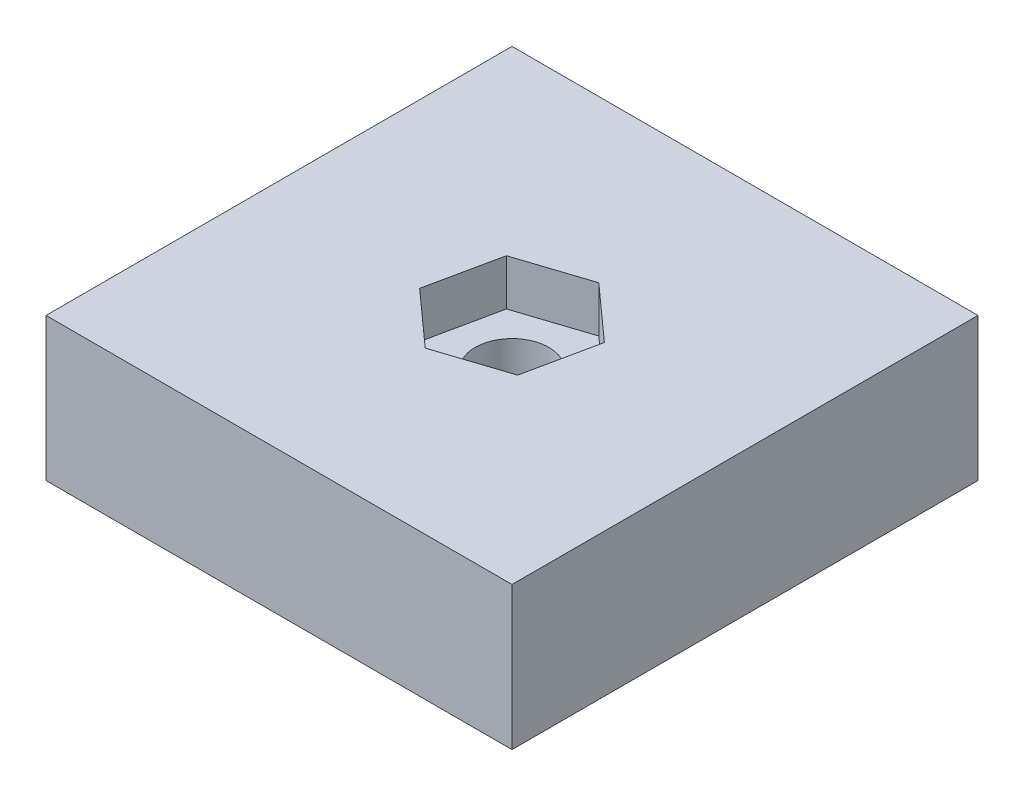
ISO-10303-21;
HEADER;
FILE_DESCRIPTION(('STEP AP214'),'2;1');
FILE_NAME('part.step','',(''),(''),'','','');
FILE_SCHEMA(('AUTOMOTIVE_DESIGN { 1 0 10303 214 1 1 1 1 }'));
ENDSEC;
DATA;
#1=APPLICATION_CONTEXT('core data for automotive mechanical design processes');
#2=APPLICATION_PROTOCOL_DEFINITION('international standard','automotive_design',2000,#1);
#3=PRODUCT_CONTEXT('',#1,'mechanical');
#4=PRODUCT('Part','Part','',(#3));
#5=PRODUCT_RELATED_PRODUCT_CATEGORY('part','',(#4));
#6=PRODUCT_DEFINITION_FORMATION('','',#4);
#7=PRODUCT_DEFINITION_CONTEXT('part definition',#1,'design');
#8=PRODUCT_DEFINITION('design','',#6,#7);
#9=PRODUCT_DEFINITION_SHAPE('','',#8);
#10=(LENGTH_UNIT() NAMED_UNIT(*) SI_UNIT(.MILLI.,.METRE.));
#11=(NAMED_UNIT(*) PLANE_ANGLE_UNIT() SI_UNIT($,.RADIAN.));
#12=(NAMED_UNIT(*) SI_UNIT($,.STERADIAN.) SOLID_ANGLE_UNIT());
#13=UNCERTAINTY_MEASURE_WITH_UNIT(LENGTH_MEASURE(1.E-05),#10,'distance_accuracy_value','');
#14=(GEOMETRIC_REPRESENTATION_CONTEXT(3) GLOBAL_UNCERTAINTY_ASSIGNED_CONTEXT((#13)) GLOBAL_UNIT_ASSIGNED_CONTEXT((#10,
#11,#12)) REPRESENTATION_CONTEXT('',''));
#15=CARTESIAN_POINT('',(0.,0.,0.));
#16=DIRECTION('',(0.,0.,1.));
#17=DIRECTION('',(1.,0.,0.));
#18=AXIS2_PLACEMENT_3D('',#15,#16,#17);
#19=CARTESIAN_POINT('',(0.,6.2,0.));
#20=DIRECTION('',(0.,1.,0.));
#21=DIRECTION('',(0.,0.,1.));
#22=AXIS2_PLACEMENT_3D('',#19,#20,#21);
#23=PLANE('',#22);
#24=DIRECTION('',(1.,0.,0.));
#25=VECTOR('',#24,1.);
#26=CARTESIAN_POINT('',(0.,6.2,23.));
#27=LINE('',#26,#25);
#28=CARTESIAN_POINT('',(0.,6.2,23.));
#29=VERTEX_POINT('',#28);
#30=CARTESIAN_POINT('',(20.2,6.2,23.));
#31=VERTEX_POINT('',#30);
#32=EDGE_CURVE('E178',#29,#31,#27,.T.);
#33=ORIENTED_EDGE('',*,*,#32,.T.);
#34=DIRECTION('',(0.,0.,-1.));
#35=VECTOR('',#34,1.);
#36=CARTESIAN_POINT('',(20.2,6.2,23.));
#37=LINE('',#36,#35);
#38=CARTESIAN_POINT('',(20.2,6.2,2.8));
#39=VERTEX_POINT('',#38);
#40=EDGE_CURVE('E191',#31,#39,#37,.T.);
#41=ORIENTED_EDGE('',*,*,#40,.T.);
#42=DIRECTION('',(-1.,0.,0.));
#43=VECTOR('',#42,1.);
#44=CARTESIAN_POINT('',(20.2,6.2,2.8));
#45=LINE('',#44,#43);
#46=CARTESIAN_POINT('',(0.,6.2,2.8));
#47=VERTEX_POINT('',#46);
#48=EDGE_CURVE('E194',#39,#47,#45,.T.);
#49=ORIENTED_EDGE('',*,*,#48,.T.);
#50=DIRECTION('',(0.,0.,1.));
#51=VECTOR('',#50,1.);
#52=CARTESIAN_POINT('',(0.,6.2,2.8));
#53=LINE('',#52,#51);
#54=EDGE_CURVE('E182',#47,#29,#53,.T.);
#55=ORIENTED_EDGE('',*,*,#54,.T.);
#56=EDGE_LOOP('',(#33,#41,#49,#55));
#57=FACE_BOUND('',#56,.T.);
#58=DIRECTION('',(0.206299791318643,0.,-0.978488832895851));
#59=VECTOR('',#58,1.);
#60=CARTESIAN_POINT('',(9.58332405240454,6.2,2.02050108870319));
#61=LINE('',#60,#59);
#62=CARTESIAN_POINT('',(7.08161079939459,6.2,13.8862352493202));
#63=VERTEX_POINT('',#62);
#64=CARTESIAN_POINT('',(7.73670061967828,6.2,10.7791158984272));
#65=VERTEX_POINT('',#64);
#66=EDGE_CURVE('E156',#63,#65,#61,.T.);
#67=ORIENTED_EDGE('',*,*,#66,.T.);
#68=DIRECTION('',(0.950546082266514,0.,-0.310583556370554));
#69=VECTOR('',#68,1.);
#70=CARTESIAN_POINT('',(3.92855226655273,6.2,12.0233988224915));
#71=LINE('',#70,#69);
#72=CARTESIAN_POINT('',(10.7550898202837,6.2,9.79288064910699));
#73=VERTEX_POINT('',#72);
#74=EDGE_CURVE('E50',#65,#73,#71,.T.);
#75=ORIENTED_EDGE('',*,*,#74,.T.);
#76=DIRECTION('',(0.744246290947871,0.,0.6679052765253));
#77=VECTOR('',#76,1.);
#78=CARTESIAN_POINT('',(-0.0700858789952581,6.2,0.0780966363395189));
#79=LINE('',#78,#77);
#80=CARTESIAN_POINT('',(13.1183892006054,6.2,11.9137647506798));
#81=VERTEX_POINT('',#80);
#82=EDGE_CURVE('E141',#73,#81,#79,.T.);
#83=ORIENTED_EDGE('',*,*,#82,.T.);
#84=DIRECTION('',(-0.206299791318643,0.,0.978488832895851));
#85=VECTOR('',#84,1.);
#86=CARTESIAN_POINT('',(14.9650126333317,6.2,3.15514994095572));
#87=LINE('',#86,#85);
#88=CARTESIAN_POINT('',(12.4632993803217,6.2,15.0208841015728));
#89=VERTEX_POINT('',#88);
#90=EDGE_CURVE('E144',#81,#89,#87,.T.);
#91=ORIENTED_EDGE('',*,*,#90,.T.);
#92=DIRECTION('',(-0.950546082266515,0.,0.310583556370554));
#93=VECTOR('',#92,1.);
#94=CARTESIAN_POINT('',(5.63676182659075,6.2,17.2514022749573));
#95=LINE('',#94,#93);
#96=CARTESIAN_POINT('',(9.4449101797163,6.2,16.007119350893));
#97=VERTEX_POINT('',#96);
#98=EDGE_CURVE('E161',#89,#97,#95,.T.);
#99=ORIENTED_EDGE('',*,*,#98,.T.);
#100=DIRECTION('',(-0.744246290947872,0.,-0.667905276525299));
#101=VECTOR('',#100,1.);
#102=CARTESIAN_POINT('',(-3.74356489988437,6.2,4.17145123655278));
#103=LINE('',#102,#101);
#104=EDGE_CURVE('E158',#97,#63,#103,.T.);
#105=ORIENTED_EDGE('',*,*,#104,.T.);
#106=EDGE_LOOP('',(#67,#75,#83,#91,#99,#105));
#107=FACE_BOUND('',#106,.T.);
#108=ADVANCED_FACE('F33',(#57,#107),#23,.T.);
#109=CARTESIAN_POINT('',(10.1,6.2,12.9));
#110=DIRECTION('',(0.,1.,0.));
#111=DIRECTION('',(0.,0.,1.));
#112=AXIS2_PLACEMENT_3D('',#109,#110,#111);
#113=CYLINDRICAL_SURFACE('',#112,1.59999999999999);
#114=CARTESIAN_POINT('',(10.1,0.,12.9));
#115=DIRECTION('',(0.,1.,0.));
#116=DIRECTION('',(0.,0.,1.));
#117=AXIS2_PLACEMENT_3D('',#114,#115,#116);
#118=CIRCLE('',#117,1.59999999999999);
#119=CARTESIAN_POINT('',(10.1,0.,14.5));
#120=VERTEX_POINT('',#119);
#121=EDGE_CURVE('E168',#120,#120,#118,.T.);
#122=ORIENTED_EDGE('',*,*,#121,.F.);
#123=EDGE_LOOP('',(#122));
#124=FACE_BOUND('',#123,.T.);
#125=CARTESIAN_POINT('',(10.1,4.2,12.9));
#126=DIRECTION('',(0.,1.,0.));
#127=DIRECTION('',(0.,0.,1.));
#128=AXIS2_PLACEMENT_3D('',#125,#126,#127);
#129=CIRCLE('',#128,1.59999999999999);
#130=CARTESIAN_POINT('',(10.1,4.2,14.5));
#131=VERTEX_POINT('',#130);
#132=EDGE_CURVE('E135',#131,#131,#129,.F.);
#133=ORIENTED_EDGE('',*,*,#132,.F.);
#134=EDGE_LOOP('',(#133));
#135=FACE_BOUND('',#134,.T.);
#136=ADVANCED_FACE('F224',(#124,#135),#113,.F.);
#137=CARTESIAN_POINT('',(0.,0.,23.));
#138=DIRECTION('',(0.,0.,1.));
#139=DIRECTION('',(1.,0.,0.));
#140=AXIS2_PLACEMENT_3D('',#137,#138,#139);
#141=PLANE('',#140);
#142=ORIENTED_EDGE('',*,*,#32,.F.);
#143=DIRECTION('',(0.,1.,0.));
#144=VECTOR('',#143,1.);
#145=CARTESIAN_POINT('',(0.,0.,23.));
#146=LINE('',#145,#144);
#147=CARTESIAN_POINT('',(0.,0.,23.));
#148=VERTEX_POINT('',#147);
#149=EDGE_CURVE('E11',#148,#29,#146,.T.);
#150=ORIENTED_EDGE('',*,*,#149,.F.);
#151=DIRECTION('',(1.,0.,0.));
#152=VECTOR('',#151,1.);
#153=CARTESIAN_POINT('',(0.,0.,23.));
#154=LINE('',#153,#152);
#155=CARTESIAN_POINT('',(20.2,0.,23.));
#156=VERTEX_POINT('',#155);
#157=EDGE_CURVE('E179',#148,#156,#154,.T.);
#158=ORIENTED_EDGE('',*,*,#157,.T.);
#159=DIRECTION('',(0.,1.,0.));
#160=VECTOR('',#159,1.);
#161=CARTESIAN_POINT('',(20.2,0.,23.));
#162=LINE('',#161,#160);
#163=EDGE_CURVE('E37',#156,#31,#162,.T.);
#164=ORIENTED_EDGE('',*,*,#163,.T.);
#165=EDGE_LOOP('',(#142,#150,#158,#164));
#166=FACE_BOUND('',#165,.T.);
#167=ADVANCED_FACE('F35',(#166),#141,.T.);
#168=CARTESIAN_POINT('',(0.,0.,2.8));
#169=DIRECTION('',(-1.,0.,0.));
#170=DIRECTION('',(0.,0.,1.));
#171=AXIS2_PLACEMENT_3D('',#168,#169,#170);
#172=PLANE('',#171);
#173=ORIENTED_EDGE('',*,*,#54,.F.);
#174=DIRECTION('',(0.,1.,0.));
#175=VECTOR('',#174,1.);
#176=CARTESIAN_POINT('',(0.,0.,2.8));
#177=LINE('',#176,#175);
#178=CARTESIAN_POINT('',(0.,0.,2.8));
#179=VERTEX_POINT('',#178);
#180=EDGE_CURVE('E42',#179,#47,#177,.T.);
#181=ORIENTED_EDGE('',*,*,#180,.F.);
#182=DIRECTION('',(0.,0.,1.));
#183=VECTOR('',#182,1.);
#184=CARTESIAN_POINT('',(0.,0.,2.8));
#185=LINE('',#184,#183);
#186=EDGE_CURVE('E187',#179,#148,#185,.T.);
#187=ORIENTED_EDGE('',*,*,#186,.T.);
#188=ORIENTED_EDGE('',*,*,#149,.T.);
#189=EDGE_LOOP('',(#173,#181,#187,#188));
#190=FACE_BOUND('',#189,.T.);
#191=ADVANCED_FACE('F204',(#190),#172,.T.);
#192=CARTESIAN_POINT('',(20.2,0.,2.8));
#193=DIRECTION('',(0.,0.,-1.));
#194=DIRECTION('',(-1.,0.,0.));
#195=AXIS2_PLACEMENT_3D('',#192,#193,#194);
#196=PLANE('',#195);
#197=ORIENTED_EDGE('',*,*,#48,.F.);
#198=DIRECTION('',(0.,1.,0.));
#199=VECTOR('',#198,1.);
#200=CARTESIAN_POINT('',(20.2,0.,2.8));
#201=LINE('',#200,#199);
#202=CARTESIAN_POINT('',(20.2,0.,2.8));
#203=VERTEX_POINT('',#202);
#204=EDGE_CURVE('E199',#203,#39,#201,.T.);
#205=ORIENTED_EDGE('',*,*,#204,.F.);
#206=DIRECTION('',(-1.,0.,0.));
#207=VECTOR('',#206,1.);
#208=CARTESIAN_POINT('',(20.2,0.,2.8));
#209=LINE('',#208,#207);
#210=EDGE_CURVE('E184',#203,#179,#209,.T.);
#211=ORIENTED_EDGE('',*,*,#210,.T.);
#212=ORIENTED_EDGE('',*,*,#180,.T.);
#213=EDGE_LOOP('',(#197,#205,#211,#212));
#214=FACE_BOUND('',#213,.T.);
#215=ADVANCED_FACE('F208',(#214),#196,.T.);
#216=CARTESIAN_POINT('',(20.2,0.,23.));
#217=DIRECTION('',(1.,0.,0.));
#218=DIRECTION('',(0.,0.,-1.));
#219=AXIS2_PLACEMENT_3D('',#216,#217,#218);
#220=PLANE('',#219);
#221=ORIENTED_EDGE('',*,*,#40,.F.);
#222=ORIENTED_EDGE('',*,*,#163,.F.);
#223=DIRECTION('',(0.,0.,-1.));
#224=VECTOR('',#223,1.);
#225=CARTESIAN_POINT('',(20.2,0.,23.));
#226=LINE('',#225,#224);
#227=EDGE_CURVE('E181',#156,#203,#226,.T.);
#228=ORIENTED_EDGE('',*,*,#227,.T.);
#229=ORIENTED_EDGE('',*,*,#204,.T.);
#230=EDGE_LOOP('',(#221,#222,#228,#229));
#231=FACE_BOUND('',#230,.T.);
#232=ADVANCED_FACE('F201',(#231),#220,.T.);
#233=CARTESIAN_POINT('',(0.,0.,0.));
#234=DIRECTION('',(0.,1.,0.));
#235=DIRECTION('',(0.,0.,1.));
#236=AXIS2_PLACEMENT_3D('',#233,#234,#235);
#237=PLANE('',#236);
#238=ORIENTED_EDGE('',*,*,#121,.T.);
#239=EDGE_LOOP('',(#238));
#240=FACE_BOUND('',#239,.T.);
#241=ORIENTED_EDGE('',*,*,#157,.F.);
#242=ORIENTED_EDGE('',*,*,#186,.F.);
#243=ORIENTED_EDGE('',*,*,#210,.F.);
#244=ORIENTED_EDGE('',*,*,#227,.F.);
#245=EDGE_LOOP('',(#241,#242,#243,#244));
#246=FACE_BOUND('',#245,.T.);
#247=ADVANCED_FACE('F210',(#240,#246),#237,.F.);
#248=CARTESIAN_POINT('',(3.92855226655273,4.2,12.0233988224915));
#249=DIRECTION('',(0.310583556370554,0.,0.950546082266514));
#250=DIRECTION('',(0.950546082266514,0.,-0.310583556370554));
#251=AXIS2_PLACEMENT_3D('',#248,#249,#250);
#252=PLANE('',#251);
#253=ORIENTED_EDGE('',*,*,#74,.F.);
#254=DIRECTION('',(0.,1.,0.));
#255=VECTOR('',#254,1.);
#256=CARTESIAN_POINT('',(7.73670061967828,4.2,10.7791158984272));
#257=LINE('',#256,#255);
#258=CARTESIAN_POINT('',(7.73670061967828,4.2,10.7791158984272));
#259=VERTEX_POINT('',#258);
#260=EDGE_CURVE('E123',#259,#65,#257,.T.);
#261=ORIENTED_EDGE('',*,*,#260,.F.);
#262=DIRECTION('',(0.950546082266514,0.,-0.310583556370554));
#263=VECTOR('',#262,1.);
#264=CARTESIAN_POINT('',(3.92855226655273,4.2,12.0233988224915));
#265=LINE('',#264,#263);
#266=CARTESIAN_POINT('',(10.7550898202837,4.2,9.79288064910699));
#267=VERTEX_POINT('',#266);
#268=EDGE_CURVE('E130',#259,#267,#265,.T.);
#269=ORIENTED_EDGE('',*,*,#268,.T.);
#270=DIRECTION('',(0.,1.,0.));
#271=VECTOR('',#270,1.);
#272=CARTESIAN_POINT('',(10.7550898202837,4.2,9.79288064910699));
#273=LINE('',#272,#271);
#274=EDGE_CURVE('E166',#267,#73,#273,.T.);
#275=ORIENTED_EDGE('',*,*,#274,.T.);
#276=EDGE_LOOP('',(#253,#261,#269,#275));
#277=FACE_BOUND('',#276,.T.);
#278=ADVANCED_FACE('F133',(#277),#252,.T.);
#279=CARTESIAN_POINT('',(-0.0700858789952581,4.2,0.0780966363395189));
#280=DIRECTION('',(-0.6679052765253,0.,0.744246290947871));
#281=DIRECTION('',(0.744246290947871,0.,0.6679052765253));
#282=AXIS2_PLACEMENT_3D('',#279,#280,#281);
#283=PLANE('',#282);
#284=ORIENTED_EDGE('',*,*,#82,.F.);
#285=ORIENTED_EDGE('',*,*,#274,.F.);
#286=DIRECTION('',(0.744246290947871,0.,0.6679052765253));
#287=VECTOR('',#286,1.);
#288=CARTESIAN_POINT('',(-0.0700858789952581,4.2,0.0780966363395189));
#289=LINE('',#288,#287);
#290=CARTESIAN_POINT('',(13.1183892006054,4.2,11.9137647506798));
#291=VERTEX_POINT('',#290);
#292=EDGE_CURVE('E140',#267,#291,#289,.T.);
#293=ORIENTED_EDGE('',*,*,#292,.T.);
#294=DIRECTION('',(0.,1.,0.));
#295=VECTOR('',#294,1.);
#296=CARTESIAN_POINT('',(13.1183892006054,4.2,11.9137647506798));
#297=LINE('',#296,#295);
#298=EDGE_CURVE('E169',#291,#81,#297,.T.);
#299=ORIENTED_EDGE('',*,*,#298,.T.);
#300=EDGE_LOOP('',(#284,#285,#293,#299));
#301=FACE_BOUND('',#300,.T.);
#302=ADVANCED_FACE('F219',(#301),#283,.T.);
#303=CARTESIAN_POINT('',(14.9650126333317,4.2,3.15514994095572));
#304=DIRECTION('',(-0.978488832895851,0.,-0.206299791318643));
#305=DIRECTION('',(-0.206299791318643,0.,0.978488832895851));
#306=AXIS2_PLACEMENT_3D('',#303,#304,#305);
#307=PLANE('',#306);
#308=ORIENTED_EDGE('',*,*,#90,.F.);
#309=ORIENTED_EDGE('',*,*,#298,.F.);
#310=DIRECTION('',(-0.206299791318643,0.,0.978488832895851));
#311=VECTOR('',#310,1.);
#312=CARTESIAN_POINT('',(14.9650126333317,4.2,3.15514994095572));
#313=LINE('',#312,#311);
#314=CARTESIAN_POINT('',(12.4632993803217,4.2,15.0208841015728));
#315=VERTEX_POINT('',#314);
#316=EDGE_CURVE('E150',#291,#315,#313,.T.);
#317=ORIENTED_EDGE('',*,*,#316,.T.);
#318=DIRECTION('',(0.,1.,0.));
#319=VECTOR('',#318,1.);
#320=CARTESIAN_POINT('',(12.4632993803217,4.2,15.0208841015728));
#321=LINE('',#320,#319);
#322=EDGE_CURVE('E171',#315,#89,#321,.T.);
#323=ORIENTED_EDGE('',*,*,#322,.T.);
#324=EDGE_LOOP('',(#308,#309,#317,#323));
#325=FACE_BOUND('',#324,.T.);
#326=ADVANCED_FACE('F270',(#325),#307,.T.);
#327=CARTESIAN_POINT('',(5.63676182659075,4.2,17.2514022749573));
#328=DIRECTION('',(-0.310583556370553,0.,-0.950546082266514));
#329=DIRECTION('',(-0.950546082266515,0.,0.310583556370554));
#330=AXIS2_PLACEMENT_3D('',#327,#328,#329);
#331=PLANE('',#330);
#332=ORIENTED_EDGE('',*,*,#98,.F.);
#333=ORIENTED_EDGE('',*,*,#322,.F.);
#334=DIRECTION('',(-0.950546082266515,0.,0.310583556370554));
#335=VECTOR('',#334,1.);
#336=CARTESIAN_POINT('',(5.63676182659075,4.2,17.2514022749573));
#337=LINE('',#336,#335);
#338=CARTESIAN_POINT('',(9.4449101797163,4.2,16.007119350893));
#339=VERTEX_POINT('',#338);
#340=EDGE_CURVE('E148',#315,#339,#337,.T.);
#341=ORIENTED_EDGE('',*,*,#340,.T.);
#342=DIRECTION('',(0.,1.,0.));
#343=VECTOR('',#342,1.);
#344=CARTESIAN_POINT('',(9.4449101797163,4.2,16.007119350893));
#345=LINE('',#344,#343);
#346=EDGE_CURVE('E173',#339,#97,#345,.T.);
#347=ORIENTED_EDGE('',*,*,#346,.T.);
#348=EDGE_LOOP('',(#332,#333,#341,#347));
#349=FACE_BOUND('',#348,.T.);
#350=ADVANCED_FACE('F279',(#349),#331,.T.);
#351=CARTESIAN_POINT('',(-3.74356489988437,4.2,4.17145123655278));
#352=DIRECTION('',(0.667905276525299,0.,-0.744246290947872));
#353=DIRECTION('',(-0.744246290947872,0.,-0.667905276525299));
#354=AXIS2_PLACEMENT_3D('',#351,#352,#353);
#355=PLANE('',#354);
#356=ORIENTED_EDGE('',*,*,#104,.F.);
#357=ORIENTED_EDGE('',*,*,#346,.F.);
#358=DIRECTION('',(-0.744246290947872,0.,-0.667905276525299));
#359=VECTOR('',#358,1.);
#360=CARTESIAN_POINT('',(-3.74356489988437,4.2,4.17145123655278));
#361=LINE('',#360,#359);
#362=CARTESIAN_POINT('',(7.08161079939459,4.2,13.8862352493202));
#363=VERTEX_POINT('',#362);
#364=EDGE_CURVE('E129',#339,#363,#361,.T.);
#365=ORIENTED_EDGE('',*,*,#364,.T.);
#366=DIRECTION('',(0.,1.,0.));
#367=VECTOR('',#366,1.);
#368=CARTESIAN_POINT('',(7.08161079939459,4.2,13.8862352493202));
#369=LINE('',#368,#367);
#370=EDGE_CURVE('E125',#363,#63,#369,.T.);
#371=ORIENTED_EDGE('',*,*,#370,.T.);
#372=EDGE_LOOP('',(#356,#357,#365,#371));
#373=FACE_BOUND('',#372,.T.);
#374=ADVANCED_FACE('F288',(#373),#355,.T.);
#375=CARTESIAN_POINT('',(9.58332405240454,4.2,2.02050108870319));
#376=DIRECTION('',(0.978488832895851,0.,0.206299791318643));
#377=DIRECTION('',(0.206299791318643,0.,-0.978488832895851));
#378=AXIS2_PLACEMENT_3D('',#375,#376,#377);
#379=PLANE('',#378);
#380=ORIENTED_EDGE('',*,*,#66,.F.);
#381=ORIENTED_EDGE('',*,*,#370,.F.);
#382=DIRECTION('',(0.206299791318643,0.,-0.978488832895851));
#383=VECTOR('',#382,1.);
#384=CARTESIAN_POINT('',(9.58332405240454,4.2,2.02050108870319));
#385=LINE('',#384,#383);
#386=EDGE_CURVE('E120',#363,#259,#385,.T.);
#387=ORIENTED_EDGE('',*,*,#386,.T.);
#388=ORIENTED_EDGE('',*,*,#260,.T.);
#389=EDGE_LOOP('',(#380,#381,#387,#388));
#390=FACE_BOUND('',#389,.T.);
#391=ADVANCED_FACE('F122',(#390),#379,.T.);
#392=CARTESIAN_POINT('',(0.,4.2,0.));
#393=DIRECTION('',(0.,1.,0.));
#394=DIRECTION('',(0.,0.,1.));
#395=AXIS2_PLACEMENT_3D('',#392,#393,#394);
#396=PLANE('',#395);
#397=ORIENTED_EDGE('',*,*,#268,.F.);
#398=ORIENTED_EDGE('',*,*,#386,.F.);
#399=ORIENTED_EDGE('',*,*,#364,.F.);
#400=ORIENTED_EDGE('',*,*,#340,.F.);
#401=ORIENTED_EDGE('',*,*,#316,.F.);
#402=ORIENTED_EDGE('',*,*,#292,.F.);
#403=EDGE_LOOP('',(#397,#398,#399,#400,#401,#402));
#404=FACE_BOUND('',#403,.T.);
#405=ORIENTED_EDGE('',*,*,#132,.T.);
#406=EDGE_LOOP('',(#405));
#407=FACE_BOUND('',#406,.T.);
#408=ADVANCED_FACE('F137',(#404,#407),#396,.T.);
#409=CLOSED_SHELL('',(#108,#136,#167,#191,#215,#232,#247,#278,#302,#326,#350,#374,#391,#408));
#410=MANIFOLD_SOLID_BREP('B2',#409);
#411=ADVANCED_BREP_SHAPE_REPRESENTATION('',(#18,#410),#14);
#412=SHAPE_DEFINITION_REPRESENTATION(#9,#411);
ENDSEC;
END-ISO-10303-21;
